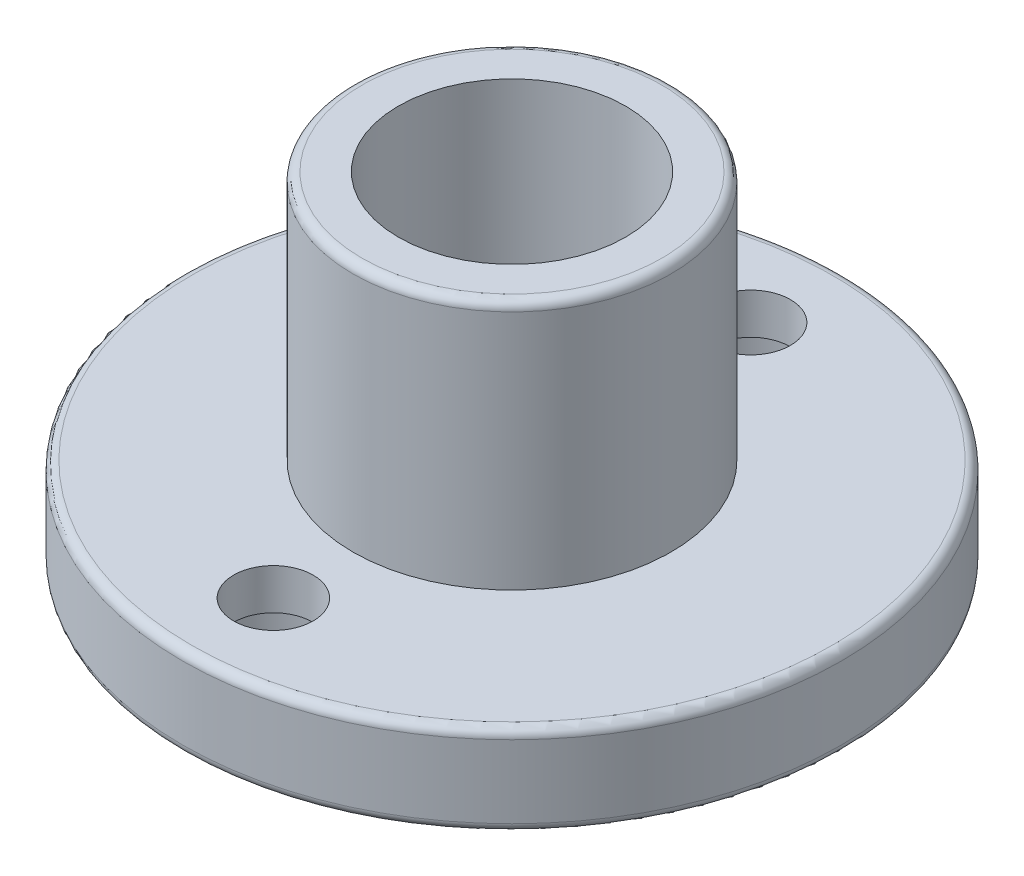
ISO-10303-21;
HEADER;
FILE_DESCRIPTION(('STEP AP214'),'2;1');
FILE_NAME('part.step','',(''),(''),'','','');
FILE_SCHEMA(('AUTOMOTIVE_DESIGN { 1 0 10303 214 1 1 1 1 }'));
ENDSEC;
DATA;
#1=APPLICATION_CONTEXT('core data for automotive mechanical design processes');
#2=APPLICATION_PROTOCOL_DEFINITION('international standard','automotive_design',2000,#1);
#3=PRODUCT_CONTEXT('',#1,'mechanical');
#4=PRODUCT('Part','Part','',(#3));
#5=PRODUCT_RELATED_PRODUCT_CATEGORY('part','',(#4));
#6=PRODUCT_DEFINITION_FORMATION('','',#4);
#7=PRODUCT_DEFINITION_CONTEXT('part definition',#1,'design');
#8=PRODUCT_DEFINITION('design','',#6,#7);
#9=PRODUCT_DEFINITION_SHAPE('','',#8);
#10=(LENGTH_UNIT() NAMED_UNIT(*) SI_UNIT(.MILLI.,.METRE.));
#11=(NAMED_UNIT(*) PLANE_ANGLE_UNIT() SI_UNIT($,.RADIAN.));
#12=(NAMED_UNIT(*) SI_UNIT($,.STERADIAN.) SOLID_ANGLE_UNIT());
#13=UNCERTAINTY_MEASURE_WITH_UNIT(LENGTH_MEASURE(1.E-05),#10,'distance_accuracy_value','');
#14=(GEOMETRIC_REPRESENTATION_CONTEXT(3) GLOBAL_UNCERTAINTY_ASSIGNED_CONTEXT((#13)) GLOBAL_UNIT_ASSIGNED_CONTEXT((#10,
#11,#12)) REPRESENTATION_CONTEXT('',''));
#15=CARTESIAN_POINT('',(0.,0.,0.));
#16=DIRECTION('',(0.,0.,1.));
#17=DIRECTION('',(1.,0.,0.));
#18=AXIS2_PLACEMENT_3D('',#15,#16,#17);
#19=CARTESIAN_POINT('',(0.,4.,0.));
#20=DIRECTION('',(0.,-1.,0.));
#21=DIRECTION('',(0.,0.,-1.));
#22=AXIS2_PLACEMENT_3D('',#19,#20,#21);
#23=CYLINDRICAL_SURFACE('',#22,14.5);
#24=CARTESIAN_POINT('',(0.,0.4,0.));
#25=DIRECTION('',(0.,1.,0.));
#26=DIRECTION('',(0.,0.,1.));
#27=AXIS2_PLACEMENT_3D('',#24,#25,#26);
#28=CIRCLE('',#27,14.5);
#29=CARTESIAN_POINT('',(0.,0.4,14.5));
#30=VERTEX_POINT('',#29);
#31=EDGE_CURVE('E54',#30,#30,#28,.T.);
#32=ORIENTED_EDGE('',*,*,#31,.T.);
#33=EDGE_LOOP('',(#32));
#34=FACE_BOUND('',#33,.T.);
#35=CARTESIAN_POINT('',(0.,3.6,0.));
#36=DIRECTION('',(0.,1.,0.));
#37=DIRECTION('',(0.,0.,1.));
#38=AXIS2_PLACEMENT_3D('',#35,#36,#37);
#39=CIRCLE('',#38,14.5);
#40=CARTESIAN_POINT('',(0.,3.6,14.5));
#41=VERTEX_POINT('',#40);
#42=EDGE_CURVE('E57',#41,#41,#39,.F.);
#43=ORIENTED_EDGE('',*,*,#42,.T.);
#44=EDGE_LOOP('',(#43));
#45=FACE_BOUND('',#44,.T.);
#46=ADVANCED_FACE('F34',(#34,#45),#23,.T.);
#47=CARTESIAN_POINT('',(0.,4.,0.));
#48=DIRECTION('',(0.,1.,0.));
#49=DIRECTION('',(0.,0.,1.));
#50=AXIS2_PLACEMENT_3D('',#47,#48,#49);
#51=PLANE('',#50);
#52=CARTESIAN_POINT('',(0.,4.,0.));
#53=DIRECTION('',(0.,1.,0.));
#54=DIRECTION('',(0.,0.,1.));
#55=AXIS2_PLACEMENT_3D('',#52,#53,#54);
#56=CIRCLE('',#55,14.1);
#57=CARTESIAN_POINT('',(0.,4.,14.1));
#58=VERTEX_POINT('',#57);
#59=EDGE_CURVE('E45',#58,#58,#56,.T.);
#60=ORIENTED_EDGE('',*,*,#59,.T.);
#61=EDGE_LOOP('',(#60));
#62=FACE_BOUND('',#61,.T.);
#63=CARTESIAN_POINT('',(0.,4.,10.5));
#64=DIRECTION('',(0.,1.,0.));
#65=DIRECTION('',(0.,0.,1.));
#66=AXIS2_PLACEMENT_3D('',#63,#64,#65);
#67=CIRCLE('',#66,1.75);
#68=CARTESIAN_POINT('',(0.,4.,12.25));
#69=VERTEX_POINT('',#68);
#70=EDGE_CURVE('E87',#69,#69,#67,.T.);
#71=ORIENTED_EDGE('',*,*,#70,.F.);
#72=EDGE_LOOP('',(#71));
#73=FACE_BOUND('',#72,.T.);
#74=CARTESIAN_POINT('',(0.,4.,-10.5));
#75=DIRECTION('',(0.,1.,0.));
#76=DIRECTION('',(0.,0.,1.));
#77=AXIS2_PLACEMENT_3D('',#74,#75,#76);
#78=CIRCLE('',#77,1.75);
#79=CARTESIAN_POINT('',(0.,4.,-8.75));
#80=VERTEX_POINT('',#79);
#81=EDGE_CURVE('E74',#80,#80,#78,.T.);
#82=ORIENTED_EDGE('',*,*,#81,.F.);
#83=EDGE_LOOP('',(#82));
#84=FACE_BOUND('',#83,.T.);
#85=CARTESIAN_POINT('',(0.,4.,0.));
#86=DIRECTION('',(0.,1.,0.));
#87=DIRECTION('',(0.,0.,1.));
#88=AXIS2_PLACEMENT_3D('',#85,#86,#87);
#89=CIRCLE('',#88,7.);
#90=CARTESIAN_POINT('',(0.,4.,7.));
#91=VERTEX_POINT('',#90);
#92=EDGE_CURVE('E60',#91,#91,#89,.T.);
#93=ORIENTED_EDGE('',*,*,#92,.F.);
#94=EDGE_LOOP('',(#93));
#95=FACE_BOUND('',#94,.T.);
#96=ADVANCED_FACE('F113',(#62,#73,#84,#95),#51,.T.);
#97=CARTESIAN_POINT('',(0.,0.,0.));
#98=DIRECTION('',(0.,1.,0.));
#99=DIRECTION('',(0.,0.,1.));
#100=AXIS2_PLACEMENT_3D('',#97,#98,#99);
#101=PLANE('',#100);
#102=CARTESIAN_POINT('',(0.,0.,0.));
#103=DIRECTION('',(0.,1.,0.));
#104=DIRECTION('',(0.,0.,1.));
#105=AXIS2_PLACEMENT_3D('',#102,#103,#104);
#106=CIRCLE('',#105,14.1);
#107=CARTESIAN_POINT('',(0.,0.,14.1));
#108=VERTEX_POINT('',#107);
#109=EDGE_CURVE('E49',#108,#108,#106,.F.);
#110=ORIENTED_EDGE('',*,*,#109,.T.);
#111=EDGE_LOOP('',(#110));
#112=FACE_BOUND('',#111,.T.);
#113=CARTESIAN_POINT('',(0.,0.,10.5));
#114=DIRECTION('',(0.,-1.,0.));
#115=DIRECTION('',(0.,0.,-1.));
#116=AXIS2_PLACEMENT_3D('',#113,#114,#115);
#117=CIRCLE('',#116,3.);
#118=CARTESIAN_POINT('',(0.,0.,7.5));
#119=VERTEX_POINT('',#118);
#120=EDGE_CURVE('E77',#119,#119,#117,.T.);
#121=ORIENTED_EDGE('',*,*,#120,.F.);
#122=EDGE_LOOP('',(#121));
#123=FACE_BOUND('',#122,.T.);
#124=CARTESIAN_POINT('',(0.,0.,-10.5));
#125=DIRECTION('',(0.,-1.,0.));
#126=DIRECTION('',(0.,0.,-1.));
#127=AXIS2_PLACEMENT_3D('',#124,#125,#126);
#128=CIRCLE('',#127,3.);
#129=CARTESIAN_POINT('',(0.,0.,-13.5));
#130=VERTEX_POINT('',#129);
#131=EDGE_CURVE('E70',#130,#130,#128,.T.);
#132=ORIENTED_EDGE('',*,*,#131,.F.);
#133=EDGE_LOOP('',(#132));
#134=FACE_BOUND('',#133,.T.);
#135=CARTESIAN_POINT('',(0.,0.,0.));
#136=DIRECTION('',(0.,1.,0.));
#137=DIRECTION('',(0.,0.,1.));
#138=AXIS2_PLACEMENT_3D('',#135,#136,#137);
#139=CIRCLE('',#138,5.);
#140=CARTESIAN_POINT('',(0.,0.,5.));
#141=VERTEX_POINT('',#140);
#142=EDGE_CURVE('E64',#141,#141,#139,.T.);
#143=ORIENTED_EDGE('',*,*,#142,.T.);
#144=EDGE_LOOP('',(#143));
#145=FACE_BOUND('',#144,.T.);
#146=ADVANCED_FACE('F109',(#112,#123,#134,#145),#101,.F.);
#147=CARTESIAN_POINT('',(0.,15.,0.));
#148=DIRECTION('',(0.,-1.,0.));
#149=DIRECTION('',(0.,0.,-1.));
#150=AXIS2_PLACEMENT_3D('',#147,#148,#149);
#151=CYLINDRICAL_SURFACE('',#150,5.);
#152=CARTESIAN_POINT('',(0.,15.,0.));
#153=DIRECTION('',(0.,1.,0.));
#154=DIRECTION('',(0.,0.,1.));
#155=AXIS2_PLACEMENT_3D('',#152,#153,#154);
#156=CIRCLE('',#155,5.);
#157=CARTESIAN_POINT('',(0.,15.,5.));
#158=VERTEX_POINT('',#157);
#159=EDGE_CURVE('E63',#158,#158,#156,.T.);
#160=ORIENTED_EDGE('',*,*,#159,.T.);
#161=EDGE_LOOP('',(#160));
#162=FACE_BOUND('',#161,.T.);
#163=ORIENTED_EDGE('',*,*,#142,.F.);
#164=EDGE_LOOP('',(#163));
#165=FACE_BOUND('',#164,.T.);
#166=ADVANCED_FACE('F112',(#162,#165),#151,.F.);
#167=CARTESIAN_POINT('',(0.,15.,0.));
#168=DIRECTION('',(0.,-1.,0.));
#169=DIRECTION('',(0.,0.,-1.));
#170=AXIS2_PLACEMENT_3D('',#167,#168,#169);
#171=CYLINDRICAL_SURFACE('',#170,7.);
#172=CARTESIAN_POINT('',(0.,14.6,0.));
#173=DIRECTION('',(0.,1.,0.));
#174=DIRECTION('',(0.,0.,1.));
#175=AXIS2_PLACEMENT_3D('',#172,#173,#174);
#176=CIRCLE('',#175,7.);
#177=CARTESIAN_POINT('',(0.,14.6,7.));
#178=VERTEX_POINT('',#177);
#179=EDGE_CURVE('E10',#178,#178,#176,.F.);
#180=ORIENTED_EDGE('',*,*,#179,.T.);
#181=EDGE_LOOP('',(#180));
#182=FACE_BOUND('',#181,.T.);
#183=ORIENTED_EDGE('',*,*,#92,.T.);
#184=EDGE_LOOP('',(#183));
#185=FACE_BOUND('',#184,.T.);
#186=ADVANCED_FACE('F121',(#182,#185),#171,.T.);
#187=CARTESIAN_POINT('',(0.,15.,0.));
#188=DIRECTION('',(0.,1.,0.));
#189=DIRECTION('',(0.,0.,1.));
#190=AXIS2_PLACEMENT_3D('',#187,#188,#189);
#191=PLANE('',#190);
#192=CARTESIAN_POINT('',(0.,15.,0.));
#193=DIRECTION('',(0.,1.,0.));
#194=DIRECTION('',(0.,0.,1.));
#195=AXIS2_PLACEMENT_3D('',#192,#193,#194);
#196=CIRCLE('',#195,6.6);
#197=CARTESIAN_POINT('',(0.,15.,6.6));
#198=VERTEX_POINT('',#197);
#199=EDGE_CURVE('E41',#198,#198,#196,.T.);
#200=ORIENTED_EDGE('',*,*,#199,.T.);
#201=EDGE_LOOP('',(#200));
#202=FACE_BOUND('',#201,.T.);
#203=ORIENTED_EDGE('',*,*,#159,.F.);
#204=EDGE_LOOP('',(#203));
#205=FACE_BOUND('',#204,.T.);
#206=ADVANCED_FACE('F127',(#202,#205),#191,.T.);
#207=CARTESIAN_POINT('',(0.,2.2,-10.5));
#208=DIRECTION('',(0.,-1.,0.));
#209=DIRECTION('',(0.,0.,-1.));
#210=AXIS2_PLACEMENT_3D('',#207,#208,#209);
#211=CYLINDRICAL_SURFACE('',#210,3.);
#212=CARTESIAN_POINT('',(0.,2.2,-10.5));
#213=DIRECTION('',(0.,-1.,0.));
#214=DIRECTION('',(0.,0.,-1.));
#215=AXIS2_PLACEMENT_3D('',#212,#213,#214);
#216=CIRCLE('',#215,3.);
#217=CARTESIAN_POINT('',(0.,2.2,-13.5));
#218=VERTEX_POINT('',#217);
#219=EDGE_CURVE('E73',#218,#218,#216,.T.);
#220=ORIENTED_EDGE('',*,*,#219,.F.);
#221=EDGE_LOOP('',(#220));
#222=FACE_BOUND('',#221,.T.);
#223=ORIENTED_EDGE('',*,*,#131,.T.);
#224=EDGE_LOOP('',(#223));
#225=FACE_BOUND('',#224,.T.);
#226=ADVANCED_FACE('F168',(#222,#225),#211,.F.);
#227=CARTESIAN_POINT('',(0.,2.2,0.));
#228=DIRECTION('',(0.,-1.,0.));
#229=DIRECTION('',(0.,0.,-1.));
#230=AXIS2_PLACEMENT_3D('',#227,#228,#229);
#231=PLANE('',#230);
#232=CARTESIAN_POINT('',(0.,2.2,-10.5));
#233=DIRECTION('',(0.,-1.,0.));
#234=DIRECTION('',(0.,0.,-1.));
#235=AXIS2_PLACEMENT_3D('',#232,#233,#234);
#236=CIRCLE('',#235,1.75);
#237=CARTESIAN_POINT('',(0.,2.2,-12.25));
#238=VERTEX_POINT('',#237);
#239=EDGE_CURVE('E84',#238,#238,#236,.T.);
#240=ORIENTED_EDGE('',*,*,#239,.F.);
#241=EDGE_LOOP('',(#240));
#242=FACE_BOUND('',#241,.T.);
#243=ORIENTED_EDGE('',*,*,#219,.T.);
#244=EDGE_LOOP('',(#243));
#245=FACE_BOUND('',#244,.T.);
#246=ADVANCED_FACE('F105',(#242,#245),#231,.T.);
#247=CARTESIAN_POINT('',(0.,2.2,10.5));
#248=DIRECTION('',(0.,-1.,0.));
#249=DIRECTION('',(0.,0.,-1.));
#250=AXIS2_PLACEMENT_3D('',#247,#248,#249);
#251=CYLINDRICAL_SURFACE('',#250,3.);
#252=CARTESIAN_POINT('',(0.,2.2,10.5));
#253=DIRECTION('',(0.,-1.,0.));
#254=DIRECTION('',(0.,0.,-1.));
#255=AXIS2_PLACEMENT_3D('',#252,#253,#254);
#256=CIRCLE('',#255,3.);
#257=CARTESIAN_POINT('',(0.,2.2,7.5));
#258=VERTEX_POINT('',#257);
#259=EDGE_CURVE('E67',#258,#258,#256,.T.);
#260=ORIENTED_EDGE('',*,*,#259,.F.);
#261=EDGE_LOOP('',(#260));
#262=FACE_BOUND('',#261,.T.);
#263=ORIENTED_EDGE('',*,*,#120,.T.);
#264=EDGE_LOOP('',(#263));
#265=FACE_BOUND('',#264,.T.);
#266=ADVANCED_FACE('F99',(#262,#265),#251,.F.);
#267=CARTESIAN_POINT('',(0.,2.2,0.));
#268=DIRECTION('',(0.,-1.,0.));
#269=DIRECTION('',(0.,0.,-1.));
#270=AXIS2_PLACEMENT_3D('',#267,#268,#269);
#271=PLANE('',#270);
#272=CARTESIAN_POINT('',(0.,2.2,10.5));
#273=DIRECTION('',(0.,-1.,0.));
#274=DIRECTION('',(0.,0.,-1.));
#275=AXIS2_PLACEMENT_3D('',#272,#273,#274);
#276=CIRCLE('',#275,1.75);
#277=CARTESIAN_POINT('',(0.,2.2,8.75));
#278=VERTEX_POINT('',#277);
#279=EDGE_CURVE('E90',#278,#278,#276,.T.);
#280=ORIENTED_EDGE('',*,*,#279,.F.);
#281=EDGE_LOOP('',(#280));
#282=FACE_BOUND('',#281,.T.);
#283=ORIENTED_EDGE('',*,*,#259,.T.);
#284=EDGE_LOOP('',(#283));
#285=FACE_BOUND('',#284,.T.);
#286=ADVANCED_FACE('F96',(#282,#285),#271,.T.);
#287=CARTESIAN_POINT('',(0.,15.,10.5));
#288=DIRECTION('',(0.,-1.,0.));
#289=DIRECTION('',(0.,0.,-1.));
#290=AXIS2_PLACEMENT_3D('',#287,#288,#289);
#291=CYLINDRICAL_SURFACE('',#290,1.75);
#292=ORIENTED_EDGE('',*,*,#70,.T.);
#293=EDGE_LOOP('',(#292));
#294=FACE_BOUND('',#293,.T.);
#295=ORIENTED_EDGE('',*,*,#279,.T.);
#296=EDGE_LOOP('',(#295));
#297=FACE_BOUND('',#296,.T.);
#298=ADVANCED_FACE('F94',(#294,#297),#291,.F.);
#299=CARTESIAN_POINT('',(0.,15.,-10.5));
#300=DIRECTION('',(0.,-1.,0.));
#301=DIRECTION('',(0.,0.,-1.));
#302=AXIS2_PLACEMENT_3D('',#299,#300,#301);
#303=CYLINDRICAL_SURFACE('',#302,1.75);
#304=ORIENTED_EDGE('',*,*,#81,.T.);
#305=EDGE_LOOP('',(#304));
#306=FACE_BOUND('',#305,.T.);
#307=ORIENTED_EDGE('',*,*,#239,.T.);
#308=EDGE_LOOP('',(#307));
#309=FACE_BOUND('',#308,.T.);
#310=ADVANCED_FACE('F142',(#306,#309),#303,.F.);
#311=CARTESIAN_POINT('',(0.,0.4,0.));
#312=DIRECTION('',(0.,1.,0.));
#313=DIRECTION('',(0.,0.,1.));
#314=AXIS2_PLACEMENT_3D('',#311,#312,#313);
#315=TOROIDAL_SURFACE('',#314,14.1,0.4);
#316=ORIENTED_EDGE('',*,*,#109,.F.);
#317=EDGE_LOOP('',(#316));
#318=FACE_BOUND('',#317,.T.);
#319=ORIENTED_EDGE('',*,*,#31,.F.);
#320=EDGE_LOOP('',(#319));
#321=FACE_BOUND('',#320,.T.);
#322=ADVANCED_FACE('F139',(#318,#321),#315,.T.);
#323=CARTESIAN_POINT('',(0.,3.6,0.));
#324=DIRECTION('',(0.,1.,0.));
#325=DIRECTION('',(0.,0.,1.));
#326=AXIS2_PLACEMENT_3D('',#323,#324,#325);
#327=TOROIDAL_SURFACE('',#326,14.1,0.4);
#328=ORIENTED_EDGE('',*,*,#42,.F.);
#329=EDGE_LOOP('',(#328));
#330=FACE_BOUND('',#329,.T.);
#331=ORIENTED_EDGE('',*,*,#59,.F.);
#332=EDGE_LOOP('',(#331));
#333=FACE_BOUND('',#332,.T.);
#334=ADVANCED_FACE('F141',(#330,#333),#327,.T.);
#335=CARTESIAN_POINT('',(0.,14.6,0.));
#336=DIRECTION('',(0.,1.,0.));
#337=DIRECTION('',(0.,0.,1.));
#338=AXIS2_PLACEMENT_3D('',#335,#336,#337);
#339=TOROIDAL_SURFACE('',#338,6.6,0.4);
#340=ORIENTED_EDGE('',*,*,#179,.F.);
#341=EDGE_LOOP('',(#340));
#342=FACE_BOUND('',#341,.T.);
#343=ORIENTED_EDGE('',*,*,#199,.F.);
#344=EDGE_LOOP('',(#343));
#345=FACE_BOUND('',#344,.T.);
#346=ADVANCED_FACE('F36',(#342,#345),#339,.T.);
#347=CLOSED_SHELL('',(#46,#96,#146,#166,#186,#206,#226,#246,#266,#286,#298,#310,#322,#334,#346));
#348=MANIFOLD_SOLID_BREP('B2',#347);
#349=ADVANCED_BREP_SHAPE_REPRESENTATION('',(#18,#348),#14);
#350=SHAPE_DEFINITION_REPRESENTATION(#9,#349);
ENDSEC;
END-ISO-10303-21;
